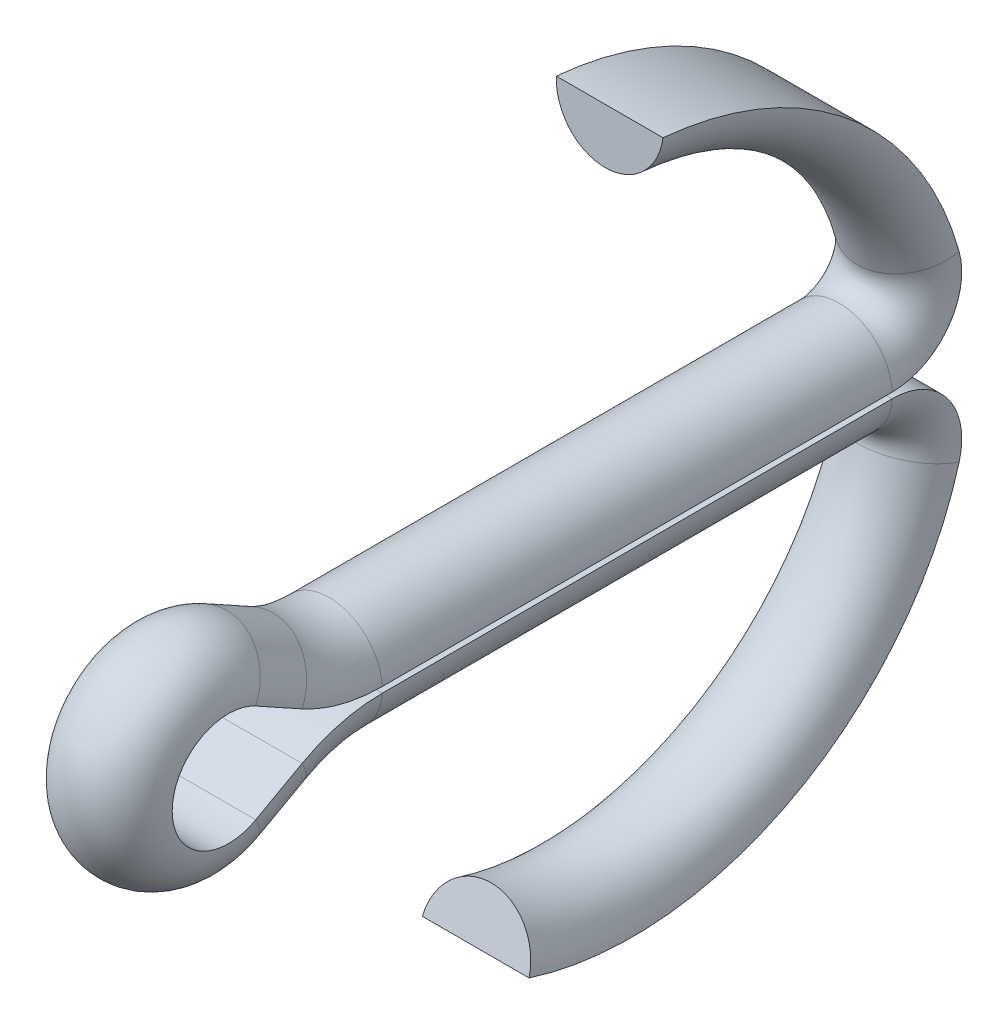
ISO-10303-21;
HEADER;
FILE_DESCRIPTION(('STEP AP214'),'2;1');
FILE_NAME('part.step','',(''),(''),'','','');
FILE_SCHEMA(('AUTOMOTIVE_DESIGN { 1 0 10303 214 1 1 1 1 }'));
ENDSEC;
DATA;
#1=APPLICATION_CONTEXT('core data for automotive mechanical design processes');
#2=APPLICATION_PROTOCOL_DEFINITION('international standard','automotive_design',2000,#1);
#3=PRODUCT_CONTEXT('',#1,'mechanical');
#4=PRODUCT('Part','Part','',(#3));
#5=PRODUCT_RELATED_PRODUCT_CATEGORY('part','',(#4));
#6=PRODUCT_DEFINITION_FORMATION('','',#4);
#7=PRODUCT_DEFINITION_CONTEXT('part definition',#1,'design');
#8=PRODUCT_DEFINITION('design','',#6,#7);
#9=PRODUCT_DEFINITION_SHAPE('','',#8);
#10=(LENGTH_UNIT() NAMED_UNIT(*) SI_UNIT(.MILLI.,.METRE.));
#11=(NAMED_UNIT(*) PLANE_ANGLE_UNIT() SI_UNIT($,.RADIAN.));
#12=(NAMED_UNIT(*) SI_UNIT($,.STERADIAN.) SOLID_ANGLE_UNIT());
#13=UNCERTAINTY_MEASURE_WITH_UNIT(LENGTH_MEASURE(1.E-05),#10,'distance_accuracy_value','');
#14=(GEOMETRIC_REPRESENTATION_CONTEXT(3) GLOBAL_UNCERTAINTY_ASSIGNED_CONTEXT((#13)) GLOBAL_UNIT_ASSIGNED_CONTEXT((#10,
#11,#12)) REPRESENTATION_CONTEXT('',''));
#15=CARTESIAN_POINT('',(0.,0.,0.));
#16=DIRECTION('',(0.,0.,1.));
#17=DIRECTION('',(1.,0.,0.));
#18=AXIS2_PLACEMENT_3D('',#15,#16,#17);
#19=CARTESIAN_POINT('',(0.,-0.364206321544341,-20.5157499936539));
#20=DIRECTION('',(0.,0.,1.));
#21=DIRECTION('',(0.,-1.,0.));
#22=AXIS2_PLACEMENT_3D('',#19,#20,#21);
#23=CYLINDRICAL_SURFACE('',#22,0.555857142857143);
#24=DIRECTION('',(0.,0.,1.));
#25=VECTOR('',#24,1.);
#26=CARTESIAN_POINT('',(0.555000000000001,-0.333349178687198,-20.5157499936539));
#27=LINE('',#26,#25);
#28=CARTESIAN_POINT('',(0.555000000000001,-0.333349178687199,-16.5257499936539));
#29=VERTEX_POINT('',#28);
#30=CARTESIAN_POINT('',(0.555000000000001,-0.333349178687199,-11.2254818440781));
#31=VERTEX_POINT('',#30);
#32=EDGE_CURVE('E242',#29,#31,#27,.T.);
#33=ORIENTED_EDGE('',*,*,#32,.F.);
#34=CARTESIAN_POINT('',(0.,-0.364206321544341,-16.5257499936539));
#35=DIRECTION('',(0.,0.,-1.));
#36=DIRECTION('',(-1.,0.,0.));
#37=AXIS2_PLACEMENT_3D('',#34,#35,#36);
#38=CIRCLE('',#37,0.555857142857143);
#39=CARTESIAN_POINT('',(-0.555,-0.333349178687199,-16.5257499936539));
#40=VERTEX_POINT('',#39);
#41=EDGE_CURVE('E246',#29,#40,#38,.F.);
#42=ORIENTED_EDGE('',*,*,#41,.T.);
#43=DIRECTION('',(0.,0.,1.));
#44=VECTOR('',#43,1.);
#45=CARTESIAN_POINT('',(-0.555,-0.333349178687198,-20.5157499936539));
#46=LINE('',#45,#44);
#47=CARTESIAN_POINT('',(-0.555,-0.333349178687199,-11.2254818440781));
#48=VERTEX_POINT('',#47);
#49=EDGE_CURVE('E171',#40,#48,#46,.T.);
#50=ORIENTED_EDGE('',*,*,#49,.T.);
#51=CARTESIAN_POINT('',(0.,-0.364206321544342,-11.2254818440781));
#52=DIRECTION('',(0.,0.,1.));
#53=DIRECTION('',(-1.,0.,0.));
#54=AXIS2_PLACEMENT_3D('',#51,#52,#53);
#55=CIRCLE('',#54,0.555857142857143);
#56=EDGE_CURVE('E245',#31,#48,#55,.T.);
#57=ORIENTED_EDGE('',*,*,#56,.F.);
#58=EDGE_LOOP('',(#33,#42,#50,#57));
#59=FACE_BOUND('',#58,.T.);
#60=ADVANCED_FACE('F43',(#59),#23,.T.);
#61=CARTESIAN_POINT('',(-0.555,-0.333349178687198,-20.5157499936539));
#62=DIRECTION('',(0.,-1.,0.));
#63=DIRECTION('',(0.,0.,-1.));
#64=AXIS2_PLACEMENT_3D('',#61,#62,#63);
#65=PLANE('',#64);
#66=ORIENTED_EDGE('',*,*,#49,.F.);
#67=DIRECTION('',(1.,0.,0.));
#68=VECTOR('',#67,1.);
#69=CARTESIAN_POINT('',(-0.555,-0.333349178687199,-16.5257499936539));
#70=LINE('',#69,#68);
#71=EDGE_CURVE('E143',#40,#29,#70,.T.);
#72=ORIENTED_EDGE('',*,*,#71,.T.);
#73=ORIENTED_EDGE('',*,*,#32,.T.);
#74=DIRECTION('',(1.,0.,0.));
#75=VECTOR('',#74,1.);
#76=CARTESIAN_POINT('',(-0.555,-0.333349178687199,-11.2254818440781));
#77=LINE('',#76,#75);
#78=EDGE_CURVE('E166',#48,#31,#77,.T.);
#79=ORIENTED_EDGE('',*,*,#78,.F.);
#80=EDGE_LOOP('',(#66,#72,#73,#79));
#81=FACE_BOUND('',#80,.T.);
#82=ADVANCED_FACE('F330',(#81),#65,.T.);
#83=CARTESIAN_POINT('',(0.,-0.362492035830054,-11.2254818440781));
#84=DIRECTION('',(0.,0.,-1.));
#85=DIRECTION('',(0.,1.,0.));
#86=AXIS2_PLACEMENT_3D('',#83,#84,#85);
#87=CYLINDRICAL_SURFACE('',#86,0.555857142857143);
#88=DIRECTION('',(0.,0.,-1.));
#89=VECTOR('',#88,1.);
#90=CARTESIAN_POINT('',(-0.555,-0.393349178687197,-11.2254818440781));
#91=LINE('',#90,#89);
#92=CARTESIAN_POINT('',(-0.555,-0.393349178687196,-11.2254818440781));
#93=VERTEX_POINT('',#92);
#94=CARTESIAN_POINT('',(-0.555,-0.393349178687197,-16.5257499936539));
#95=VERTEX_POINT('',#94);
#96=EDGE_CURVE('E52',#93,#95,#91,.T.);
#97=ORIENTED_EDGE('',*,*,#96,.T.);
#98=CARTESIAN_POINT('',(0.,-0.362492035830055,-16.5257499936539));
#99=DIRECTION('',(0.,0.,-1.));
#100=DIRECTION('',(-1.,0.,0.));
#101=AXIS2_PLACEMENT_3D('',#98,#99,#100);
#102=CIRCLE('',#101,0.555857142857143);
#103=CARTESIAN_POINT('',(0.555000000000001,-0.393349178687197,-16.5257499936539));
#104=VERTEX_POINT('',#103);
#105=EDGE_CURVE('E133',#95,#104,#102,.F.);
#106=ORIENTED_EDGE('',*,*,#105,.T.);
#107=DIRECTION('',(0.,0.,-1.));
#108=VECTOR('',#107,1.);
#109=CARTESIAN_POINT('',(0.555000000000001,-0.393349178687197,-11.2254818440781));
#110=LINE('',#109,#108);
#111=CARTESIAN_POINT('',(0.555000000000001,-0.393349178687196,-11.2254818440781));
#112=VERTEX_POINT('',#111);
#113=EDGE_CURVE('E65',#112,#104,#110,.T.);
#114=ORIENTED_EDGE('',*,*,#113,.F.);
#115=CARTESIAN_POINT('',(0.,-0.362492035830054,-11.2254818440781));
#116=DIRECTION('',(0.,0.,-1.));
#117=DIRECTION('',(-1.,0.,0.));
#118=AXIS2_PLACEMENT_3D('',#115,#116,#117);
#119=CIRCLE('',#118,0.555857142857143);
#120=EDGE_CURVE('E156',#112,#93,#119,.T.);
#121=ORIENTED_EDGE('',*,*,#120,.T.);
#122=EDGE_LOOP('',(#97,#106,#114,#121));
#123=FACE_BOUND('',#122,.T.);
#124=ADVANCED_FACE('F154',(#123),#87,.T.);
#125=CARTESIAN_POINT('',(-0.555,-0.393349178687197,-11.2254818440781));
#126=DIRECTION('',(0.,1.,0.));
#127=DIRECTION('',(0.,0.,1.));
#128=AXIS2_PLACEMENT_3D('',#125,#126,#127);
#129=PLANE('',#128);
#130=ORIENTED_EDGE('',*,*,#113,.T.);
#131=DIRECTION('',(-1.,0.,0.));
#132=VECTOR('',#131,1.);
#133=CARTESIAN_POINT('',(-0.555,-0.393349178687197,-16.5257499936539));
#134=LINE('',#133,#132);
#135=EDGE_CURVE('E11',#104,#95,#134,.T.);
#136=ORIENTED_EDGE('',*,*,#135,.T.);
#137=ORIENTED_EDGE('',*,*,#96,.F.);
#138=DIRECTION('',(1.,0.,0.));
#139=VECTOR('',#138,1.);
#140=CARTESIAN_POINT('',(-0.555,-0.393349178687197,-11.2254818440781));
#141=LINE('',#140,#139);
#142=EDGE_CURVE('E160',#93,#112,#141,.T.);
#143=ORIENTED_EDGE('',*,*,#142,.T.);
#144=EDGE_LOOP('',(#130,#136,#137,#143));
#145=FACE_BOUND('',#144,.T.);
#146=ADVANCED_FACE('F45',(#145),#129,.T.);
#147=CARTESIAN_POINT('',(0.,1.3916508213128,-11.2254818440781));
#148=DIRECTION('',(-1.,0.,0.));
#149=DIRECTION('',(0.,0.,1.));
#150=AXIS2_PLACEMENT_3D('',#147,#148,#149);
#151=TOROIDAL_SURFACE('',#150,1.75585714285718,0.555857142857143);
#152=CARTESIAN_POINT('',(-0.555,1.3916508213128,-11.2254818440781));
#153=DIRECTION('',(-1.,0.,0.));
#154=DIRECTION('',(0.,-1.,0.));
#155=AXIS2_PLACEMENT_3D('',#152,#153,#154);
#156=CIRCLE('',#155,1.72500000000004);
#157=CARTESIAN_POINT('',(-0.555,-0.117863542524628,-10.3906217447988));
#158=VERTEX_POINT('',#157);
#159=EDGE_CURVE('E177',#48,#158,#156,.T.);
#160=ORIENTED_EDGE('',*,*,#159,.T.);
#161=CARTESIAN_POINT('',(0.,-0.144866035492616,-10.375687601408));
#162=DIRECTION('',(0.,0.4839768691474,0.875080790630374));
#163=DIRECTION('',(-1.,0.,0.));
#164=AXIS2_PLACEMENT_3D('',#161,#162,#163);
#165=CIRCLE('',#164,0.555857142857143);
#166=CARTESIAN_POINT('',(0.555000000000001,-0.117863542524628,-10.3906217447988));
#167=VERTEX_POINT('',#166);
#168=EDGE_CURVE('E235',#167,#158,#165,.T.);
#169=ORIENTED_EDGE('',*,*,#168,.F.);
#170=CARTESIAN_POINT('',(0.555000000000001,1.3916508213128,-11.2254818440781));
#171=DIRECTION('',(-1.,0.,0.));
#172=DIRECTION('',(0.,-1.,0.));
#173=AXIS2_PLACEMENT_3D('',#170,#171,#172);
#174=CIRCLE('',#173,1.72500000000004);
#175=EDGE_CURVE('E170',#31,#167,#174,.T.);
#176=ORIENTED_EDGE('',*,*,#175,.F.);
#177=ORIENTED_EDGE('',*,*,#56,.T.);
#178=EDGE_LOOP('',(#160,#169,#176,#177));
#179=FACE_BOUND('',#178,.T.);
#180=ADVANCED_FACE('F326',(#179),#151,.T.);
#181=CARTESIAN_POINT('',(0.,1.3916508213128,-11.2254818440781));
#182=DIRECTION('',(-1.,0.,0.));
#183=DIRECTION('',(0.,0.,1.));
#184=AXIS2_PLACEMENT_3D('',#181,#182,#183);
#185=CYLINDRICAL_SURFACE('',#184,1.72500000000004);
#186=DIRECTION('',(1.,0.,0.));
#187=VECTOR('',#186,1.);
#188=CARTESIAN_POINT('',(-0.555,-0.117863542524593,-10.3906217447988));
#189=LINE('',#188,#187);
#190=EDGE_CURVE('E172',#158,#167,#189,.T.);
#191=ORIENTED_EDGE('',*,*,#190,.F.);
#192=ORIENTED_EDGE('',*,*,#159,.F.);
#193=ORIENTED_EDGE('',*,*,#78,.T.);
#194=ORIENTED_EDGE('',*,*,#175,.T.);
#195=EDGE_LOOP('',(#191,#192,#193,#194));
#196=FACE_BOUND('',#195,.T.);
#197=ADVANCED_FACE('F344',(#196),#185,.T.);
#198=CARTESIAN_POINT('',(0.,-0.144866035492617,-10.375687601408));
#199=DIRECTION('',(0.,0.483976869147397,0.875080790630375));
#200=DIRECTION('',(0.,-0.875080790630376,0.483976869147397));
#201=AXIS2_PLACEMENT_3D('',#198,#199,#200);
#202=CYLINDRICAL_SURFACE('',#201,0.555857142857143);
#203=DIRECTION('',(0.,0.483976869147397,0.875080790630375));
#204=VECTOR('',#203,1.);
#205=CARTESIAN_POINT('',(-0.555,-0.117863542524594,-10.3906217447988));
#206=LINE('',#205,#204);
#207=CARTESIAN_POINT('',(-0.555,0.148573083831572,-9.90887646210508));
#208=VERTEX_POINT('',#207);
#209=EDGE_CURVE('E183',#158,#208,#206,.T.);
#210=ORIENTED_EDGE('',*,*,#209,.T.);
#211=CARTESIAN_POINT('',(0.,0.121570590863549,-9.89394231871425));
#212=DIRECTION('',(0.,0.483976869147397,0.875080790630375));
#213=DIRECTION('',(-1.,0.,0.));
#214=AXIS2_PLACEMENT_3D('',#211,#212,#213);
#215=CIRCLE('',#214,0.555857142857143);
#216=CARTESIAN_POINT('',(0.555000000000001,0.148573083831572,-9.90887646210508));
#217=VERTEX_POINT('',#216);
#218=EDGE_CURVE('E225',#217,#208,#215,.T.);
#219=ORIENTED_EDGE('',*,*,#218,.F.);
#220=DIRECTION('',(0.,0.483976869147397,0.875080790630375));
#221=VECTOR('',#220,1.);
#222=CARTESIAN_POINT('',(0.555000000000001,-0.117863542524594,-10.3906217447988));
#223=LINE('',#222,#221);
#224=EDGE_CURVE('E176',#167,#217,#223,.T.);
#225=ORIENTED_EDGE('',*,*,#224,.F.);
#226=ORIENTED_EDGE('',*,*,#168,.T.);
#227=EDGE_LOOP('',(#210,#219,#225,#226));
#228=FACE_BOUND('',#227,.T.);
#229=ADVANCED_FACE('F346',(#228),#202,.T.);
#230=CARTESIAN_POINT('',(-0.555,-0.117863542524594,-10.3906217447988));
#231=DIRECTION('',(0.,-0.875080790630375,0.483976869147397));
#232=DIRECTION('',(0.,-0.483976869147397,-0.875080790630375));
#233=AXIS2_PLACEMENT_3D('',#230,#231,#232);
#234=PLANE('',#233);
#235=DIRECTION('',(1.,0.,0.));
#236=VECTOR('',#235,1.);
#237=CARTESIAN_POINT('',(-0.555,0.148573083831571,-9.90887646210508));
#238=LINE('',#237,#236);
#239=EDGE_CURVE('E178',#208,#217,#238,.T.);
#240=ORIENTED_EDGE('',*,*,#239,.F.);
#241=ORIENTED_EDGE('',*,*,#209,.F.);
#242=ORIENTED_EDGE('',*,*,#190,.T.);
#243=ORIENTED_EDGE('',*,*,#224,.T.);
#244=EDGE_LOOP('',(#240,#241,#242,#243));
#245=FACE_BOUND('',#244,.T.);
#246=ADVANCED_FACE('F349',(#245),#234,.T.);
#247=CARTESIAN_POINT('',(0.,-0.363349178687198,-9.62574999365386));
#248=DIRECTION('',(1.,0.,0.));
#249=DIRECTION('',(0.,0.,-1.));
#250=AXIS2_PLACEMENT_3D('',#247,#248,#249);
#251=DEGENERATE_TOROIDAL_SURFACE('',#250,0.554142857142856,0.555857142857143,.T.);
#252=CARTESIAN_POINT('',(-0.555,-0.363349178687198,-9.62574999365386));
#253=DIRECTION('',(1.,0.,0.));
#254=DIRECTION('',(0.,0.875080790630376,-0.483976869147396));
#255=AXIS2_PLACEMENT_3D('',#252,#253,#254);
#256=CIRCLE('',#255,0.584999999999999);
#257=CARTESIAN_POINT('',(-0.555,-0.875271441205968,-9.90887646210508));
#258=VERTEX_POINT('',#257);
#259=EDGE_CURVE('E189',#208,#258,#256,.T.);
#260=ORIENTED_EDGE('',*,*,#259,.T.);
#261=CARTESIAN_POINT('',(0.,-0.848268948237945,-9.89394231871425));
#262=DIRECTION('',(0.,0.483976869147396,-0.875080790630376));
#263=DIRECTION('',(-1.,0.,0.));
#264=AXIS2_PLACEMENT_3D('',#261,#262,#263);
#265=CIRCLE('',#264,0.555857142857143);
#266=CARTESIAN_POINT('',(0.555000000000001,-0.875271441205968,-9.90887646210508));
#267=VERTEX_POINT('',#266);
#268=EDGE_CURVE('E215',#267,#258,#265,.T.);
#269=ORIENTED_EDGE('',*,*,#268,.F.);
#270=CARTESIAN_POINT('',(0.555000000000001,-0.363349178687198,-9.62574999365386));
#271=DIRECTION('',(1.,0.,0.));
#272=DIRECTION('',(0.,0.875080790630376,-0.483976869147396));
#273=AXIS2_PLACEMENT_3D('',#270,#271,#272);
#274=CIRCLE('',#273,0.584999999999999);
#275=EDGE_CURVE('E182',#217,#267,#274,.T.);
#276=ORIENTED_EDGE('',*,*,#275,.F.);
#277=ORIENTED_EDGE('',*,*,#218,.T.);
#278=EDGE_LOOP('',(#260,#269,#276,#277));
#279=FACE_BOUND('',#278,.T.);
#280=ADVANCED_FACE('F351',(#279),#251,.T.);
#281=CARTESIAN_POINT('',(0.,-0.363349178687198,-9.62574999365386));
#282=DIRECTION('',(1.,0.,0.));
#283=DIRECTION('',(0.,0.,-1.));
#284=AXIS2_PLACEMENT_3D('',#281,#282,#283);
#285=CYLINDRICAL_SURFACE('',#284,0.584999999999999);
#286=DIRECTION('',(1.,0.,0.));
#287=VECTOR('',#286,1.);
#288=CARTESIAN_POINT('',(-0.555,-0.875271441205967,-9.90887646210508));
#289=LINE('',#288,#287);
#290=EDGE_CURVE('E184',#258,#267,#289,.T.);
#291=ORIENTED_EDGE('',*,*,#290,.F.);
#292=ORIENTED_EDGE('',*,*,#259,.F.);
#293=ORIENTED_EDGE('',*,*,#239,.T.);
#294=ORIENTED_EDGE('',*,*,#275,.T.);
#295=EDGE_LOOP('',(#291,#292,#293,#294));
#296=FACE_BOUND('',#295,.T.);
#297=ADVANCED_FACE('F354',(#296),#285,.F.);
#298=CARTESIAN_POINT('',(0.,-0.848268948237946,-9.89394231871425));
#299=DIRECTION('',(0.,0.483976869147397,-0.875080790630375));
#300=DIRECTION('',(0.,0.875080790630376,0.483976869147397));
#301=AXIS2_PLACEMENT_3D('',#298,#299,#300);
#302=CYLINDRICAL_SURFACE('',#301,0.555857142857143);
#303=DIRECTION('',(0.,0.483976869147397,-0.875080790630375));
#304=VECTOR('',#303,1.);
#305=CARTESIAN_POINT('',(-0.555,-0.875271441205968,-9.90887646210508));
#306=LINE('',#305,#304);
#307=CARTESIAN_POINT('',(-0.555,-0.608834814849802,-10.3906217447988));
#308=VERTEX_POINT('',#307);
#309=EDGE_CURVE('E193',#258,#308,#306,.T.);
#310=ORIENTED_EDGE('',*,*,#309,.T.);
#311=CARTESIAN_POINT('',(0.,-0.581832321881779,-10.375687601408));
#312=DIRECTION('',(0.,0.483976869147397,-0.875080790630375));
#313=DIRECTION('',(-1.,0.,0.));
#314=AXIS2_PLACEMENT_3D('',#311,#312,#313);
#315=CIRCLE('',#314,0.555857142857143);
#316=CARTESIAN_POINT('',(0.555000000000001,-0.608834814849802,-10.3906217447988));
#317=VERTEX_POINT('',#316);
#318=EDGE_CURVE('E206',#317,#308,#315,.T.);
#319=ORIENTED_EDGE('',*,*,#318,.F.);
#320=DIRECTION('',(0.,0.483976869147397,-0.875080790630375));
#321=VECTOR('',#320,1.);
#322=CARTESIAN_POINT('',(0.555000000000001,-0.875271441205968,-9.90887646210508));
#323=LINE('',#322,#321);
#324=EDGE_CURVE('E188',#267,#317,#323,.T.);
#325=ORIENTED_EDGE('',*,*,#324,.F.);
#326=ORIENTED_EDGE('',*,*,#268,.T.);
#327=EDGE_LOOP('',(#310,#319,#325,#326));
#328=FACE_BOUND('',#327,.T.);
#329=ADVANCED_FACE('F356',(#328),#302,.T.);
#330=CARTESIAN_POINT('',(-0.555,-0.875271441205968,-9.90887646210508));
#331=DIRECTION('',(0.,0.875080790630375,0.483976869147397));
#332=DIRECTION('',(0.,-0.483976869147397,0.875080790630375));
#333=AXIS2_PLACEMENT_3D('',#330,#331,#332);
#334=PLANE('',#333);
#335=DIRECTION('',(1.,0.,0.));
#336=VECTOR('',#335,1.);
#337=CARTESIAN_POINT('',(-0.555,-0.608834814849802,-10.3906217447988));
#338=LINE('',#337,#336);
#339=EDGE_CURVE('E190',#308,#317,#338,.T.);
#340=ORIENTED_EDGE('',*,*,#339,.F.);
#341=ORIENTED_EDGE('',*,*,#309,.F.);
#342=ORIENTED_EDGE('',*,*,#290,.T.);
#343=ORIENTED_EDGE('',*,*,#324,.T.);
#344=EDGE_LOOP('',(#340,#341,#342,#343));
#345=FACE_BOUND('',#344,.T.);
#346=ADVANCED_FACE('F359',(#345),#334,.T.);
#347=CARTESIAN_POINT('',(0.,-2.1183491786872,-11.2254818440781));
#348=DIRECTION('',(-1.,0.,0.));
#349=DIRECTION('',(0.,0.,1.));
#350=AXIS2_PLACEMENT_3D('',#347,#348,#349);
#351=TOROIDAL_SURFACE('',#350,1.75585714285714,0.555857142857143);
#352=CARTESIAN_POINT('',(-0.555,-2.1183491786872,-11.2254818440781));
#353=DIRECTION('',(-1.,0.,0.));
#354=DIRECTION('',(0.,0.875080790630374,0.4839768691474));
#355=AXIS2_PLACEMENT_3D('',#352,#353,#354);
#356=CIRCLE('',#355,1.725);
#357=EDGE_CURVE('E195',#308,#93,#356,.T.);
#358=ORIENTED_EDGE('',*,*,#357,.T.);
#359=ORIENTED_EDGE('',*,*,#120,.F.);
#360=CARTESIAN_POINT('',(0.555000000000001,-2.1183491786872,-11.2254818440781));
#361=DIRECTION('',(-1.,0.,0.));
#362=DIRECTION('',(0.,0.875080790630374,0.4839768691474));
#363=AXIS2_PLACEMENT_3D('',#360,#361,#362);
#364=CIRCLE('',#363,1.725);
#365=EDGE_CURVE('E163',#317,#112,#364,.T.);
#366=ORIENTED_EDGE('',*,*,#365,.F.);
#367=ORIENTED_EDGE('',*,*,#318,.T.);
#368=EDGE_LOOP('',(#358,#359,#366,#367));
#369=FACE_BOUND('',#368,.T.);
#370=ADVANCED_FACE('F361',(#369),#351,.T.);
#371=CARTESIAN_POINT('',(0.,-2.1183491786872,-11.2254818440781));
#372=DIRECTION('',(-1.,0.,0.));
#373=DIRECTION('',(0.,0.,1.));
#374=AXIS2_PLACEMENT_3D('',#371,#372,#373);
#375=CYLINDRICAL_SURFACE('',#374,1.725);
#376=ORIENTED_EDGE('',*,*,#142,.F.);
#377=ORIENTED_EDGE('',*,*,#357,.F.);
#378=ORIENTED_EDGE('',*,*,#339,.T.);
#379=ORIENTED_EDGE('',*,*,#365,.T.);
#380=EDGE_LOOP('',(#376,#377,#378,#379));
#381=FACE_BOUND('',#380,.T.);
#382=ADVANCED_FACE('F364',(#381),#375,.T.);
#383=CARTESIAN_POINT('',(0.,3.17805183124376,-14.1460606354816));
#384=DIRECTION('',(0.,0.0900797273229016,0.995934557451157));
#385=DIRECTION('',(-1.,0.,0.));
#386=AXIS2_PLACEMENT_3D('',#383,#384,#385);
#387=PLANE('',#386);
#388=CARTESIAN_POINT('',(0.,3.17805183124376,-14.1460606354816));
#389=DIRECTION('',(0.,0.0900797273229016,0.995934557451157));
#390=DIRECTION('',(-1.,0.,0.));
#391=AXIS2_PLACEMENT_3D('',#388,#389,#390);
#392=CIRCLE('',#391,0.555857142857143);
#393=CARTESIAN_POINT('',(-0.555,3.14732013632813,-14.1432810324671));
#394=VERTEX_POINT('',#393);
#395=CARTESIAN_POINT('',(0.555000000000001,3.14732013632813,-14.1432810324671));
#396=VERTEX_POINT('',#395);
#397=EDGE_CURVE('E269',#394,#396,#392,.T.);
#398=ORIENTED_EDGE('',*,*,#397,.T.);
#399=DIRECTION('',(-1.,0.,0.));
#400=VECTOR('',#399,1.);
#401=CARTESIAN_POINT('',(0.555000000000001,3.14732013632813,-14.1432810324671));
#402=LINE('',#401,#400);
#403=EDGE_CURVE('E264',#396,#394,#402,.T.);
#404=ORIENTED_EDGE('',*,*,#403,.T.);
#405=EDGE_LOOP('',(#398,#404));
#406=FACE_BOUND('',#405,.T.);
#407=ADVANCED_FACE('F341',(#406),#387,.T.);
#408=CARTESIAN_POINT('',(0.,-0.363349178687198,-13.8257499936539));
#409=DIRECTION('',(-1.,0.,0.));
#410=DIRECTION('',(0.,0.,1.));
#411=AXIS2_PLACEMENT_3D('',#408,#409,#410);
#412=TOROIDAL_SURFACE('',#411,3.55585714285714,0.555857142857143);
#413=CARTESIAN_POINT('',(0.555000000000001,-0.363349178687198,-13.8257499936539));
#414=DIRECTION('',(-1.,0.,0.));
#415=DIRECTION('',(0.,0.995934557451157,-0.0900797273229021));
#416=AXIS2_PLACEMENT_3D('',#413,#414,#415);
#417=CIRCLE('',#416,3.525);
#418=CARTESIAN_POINT('',(0.555000000000001,0.58264462275574,-17.2214414884206));
#419=VERTEX_POINT('',#418);
#420=EDGE_CURVE('E263',#396,#419,#417,.T.);
#421=ORIENTED_EDGE('',*,*,#420,.F.);
#422=ORIENTED_EDGE('',*,*,#397,.F.);
#423=CARTESIAN_POINT('',(-0.555,-0.363349178687198,-13.8257499936539));
#424=DIRECTION('',(-1.,0.,0.));
#425=DIRECTION('',(0.,0.995934557451157,-0.0900797273229021));
#426=AXIS2_PLACEMENT_3D('',#423,#424,#425);
#427=CIRCLE('',#426,3.525);
#428=CARTESIAN_POINT('',(-0.555,0.58264462275574,-17.2214414884206));
#429=VERTEX_POINT('',#428);
#430=EDGE_CURVE('E268',#394,#429,#427,.T.);
#431=ORIENTED_EDGE('',*,*,#430,.T.);
#432=CARTESIAN_POINT('',(0.,0.590925662719739,-17.2511666905633));
#433=DIRECTION('',(0.,0.963316736104055,0.268367035870337));
#434=DIRECTION('',(-1.,0.,0.));
#435=AXIS2_PLACEMENT_3D('',#432,#433,#434);
#436=CIRCLE('',#435,0.555857142857143);
#437=EDGE_CURVE('E278',#429,#419,#436,.T.);
#438=ORIENTED_EDGE('',*,*,#437,.T.);
#439=EDGE_LOOP('',(#421,#422,#431,#438));
#440=FACE_BOUND('',#439,.T.);
#441=ADVANCED_FACE('F383',(#440),#412,.T.);
#442=CARTESIAN_POINT('',(0.,-0.363349178687198,-13.8257499936539));
#443=DIRECTION('',(-1.,0.,0.));
#444=DIRECTION('',(0.,0.,1.));
#445=AXIS2_PLACEMENT_3D('',#442,#443,#444);
#446=CYLINDRICAL_SURFACE('',#445,3.525);
#447=DIRECTION('',(-1.,0.,0.));
#448=VECTOR('',#447,1.);
#449=CARTESIAN_POINT('',(0.555000000000001,0.58264462275574,-17.2214414884206));
#450=LINE('',#449,#448);
#451=EDGE_CURVE('E258',#419,#429,#450,.T.);
#452=ORIENTED_EDGE('',*,*,#451,.T.);
#453=ORIENTED_EDGE('',*,*,#430,.F.);
#454=ORIENTED_EDGE('',*,*,#403,.F.);
#455=ORIENTED_EDGE('',*,*,#420,.T.);
#456=EDGE_LOOP('',(#452,#453,#454,#455));
#457=FACE_BOUND('',#456,.T.);
#458=ADVANCED_FACE('F446',(#457),#446,.T.);
#459=CARTESIAN_POINT('',(0.,0.388834365616597,-16.5257499936539));
#460=DIRECTION('',(-1.,0.,0.));
#461=DIRECTION('',(0.,0.,1.));
#462=AXIS2_PLACEMENT_3D('',#459,#460,#461);
#463=TOROIDAL_SURFACE('',#462,0.753040687160938,0.555857142857143);
#464=CARTESIAN_POINT('',(0.555000000000001,0.388834365616597,-16.5257499936539));
#465=DIRECTION('',(-1.,0.,0.));
#466=DIRECTION('',(0.,0.268367035870333,-0.963316736104056));
#467=AXIS2_PLACEMENT_3D('',#464,#465,#466);
#468=CIRCLE('',#467,0.722183544303796);
#469=EDGE_CURVE('E144',#419,#29,#468,.T.);
#470=ORIENTED_EDGE('',*,*,#469,.F.);
#471=ORIENTED_EDGE('',*,*,#437,.F.);
#472=CARTESIAN_POINT('',(-0.555,0.388834365616597,-16.5257499936539));
#473=DIRECTION('',(-1.,0.,0.));
#474=DIRECTION('',(0.,0.268367035870333,-0.963316736104056));
#475=AXIS2_PLACEMENT_3D('',#472,#473,#474);
#476=CIRCLE('',#475,0.722183544303796);
#477=EDGE_CURVE('E262',#429,#40,#476,.T.);
#478=ORIENTED_EDGE('',*,*,#477,.T.);
#479=ORIENTED_EDGE('',*,*,#41,.F.);
#480=EDGE_LOOP('',(#470,#471,#478,#479));
#481=FACE_BOUND('',#480,.T.);
#482=ADVANCED_FACE('F323',(#481),#463,.T.);
#483=CARTESIAN_POINT('',(0.,0.388834365616597,-16.5257499936539));
#484=DIRECTION('',(-1.,0.,0.));
#485=DIRECTION('',(0.,0.,1.));
#486=AXIS2_PLACEMENT_3D('',#483,#484,#485);
#487=CYLINDRICAL_SURFACE('',#486,0.722183544303796);
#488=ORIENTED_EDGE('',*,*,#71,.F.);
#489=ORIENTED_EDGE('',*,*,#477,.F.);
#490=ORIENTED_EDGE('',*,*,#451,.F.);
#491=ORIENTED_EDGE('',*,*,#469,.T.);
#492=EDGE_LOOP('',(#488,#489,#490,#491));
#493=FACE_BOUND('',#492,.T.);
#494=ADVANCED_FACE('F316',(#493),#487,.T.);
#495=CARTESIAN_POINT('',(0.,-3.74993035222142,-12.7416891210679));
#496=DIRECTION('',(0.,0.304866261222988,0.952395171537486));
#497=DIRECTION('',(-1.,0.,0.));
#498=AXIS2_PLACEMENT_3D('',#495,#496,#497);
#499=PLANE('',#498);
#500=CARTESIAN_POINT('',(0.,-3.74993035222142,-12.7416891210679));
#501=DIRECTION('',(0.,0.304866261222988,0.952395171537486));
#502=DIRECTION('',(-1.,0.,0.));
#503=AXIS2_PLACEMENT_3D('',#500,#501,#502);
#504=CIRCLE('',#503,0.555857142857143);
#505=CARTESIAN_POINT('',(0.555000000000001,-3.72054215835683,-12.7510964228428));
#506=VERTEX_POINT('',#505);
#507=CARTESIAN_POINT('',(-0.555,-3.72054215835683,-12.7510964228428));
#508=VERTEX_POINT('',#507);
#509=EDGE_CURVE('E298',#506,#508,#504,.T.);
#510=ORIENTED_EDGE('',*,*,#509,.T.);
#511=DIRECTION('',(1.,0.,0.));
#512=VECTOR('',#511,1.);
#513=CARTESIAN_POINT('',(-0.555,-3.72054215835683,-12.7510964228428));
#514=LINE('',#513,#512);
#515=EDGE_CURVE('E288',#508,#506,#514,.T.);
#516=ORIENTED_EDGE('',*,*,#515,.T.);
#517=EDGE_LOOP('',(#510,#516));
#518=FACE_BOUND('',#517,.T.);
#519=ADVANCED_FACE('F314',(#518),#499,.T.);
#520=CARTESIAN_POINT('',(0.,-1.11553272299099,-16.5257499936539));
#521=DIRECTION('',(-1.,0.,0.));
#522=DIRECTION('',(0.,0.,1.));
#523=AXIS2_PLACEMENT_3D('',#520,#521,#522);
#524=TOROIDAL_SURFACE('',#523,0.753040687160938,0.555857142857143);
#525=CARTESIAN_POINT('',(-0.555,-1.11553272299099,-16.5257499936539));
#526=DIRECTION('',(-1.,0.,0.));
#527=DIRECTION('',(0.,1.,0.));
#528=AXIS2_PLACEMENT_3D('',#525,#526,#527);
#529=CIRCLE('',#528,0.722183544303795);
#530=CARTESIAN_POINT('',(-0.555,-1.30934298013014,-17.2214414884206));
#531=VERTEX_POINT('',#530);
#532=EDGE_CURVE('E137',#95,#531,#529,.T.);
#533=ORIENTED_EDGE('',*,*,#532,.T.);
#534=CARTESIAN_POINT('',(0.,-1.31762402009414,-17.2511666905633));
#535=DIRECTION('',(0.,-0.963316736104054,0.268367035870341));
#536=DIRECTION('',(-1.,0.,0.));
#537=AXIS2_PLACEMENT_3D('',#534,#535,#536);
#538=CIRCLE('',#537,0.555857142857143);
#539=CARTESIAN_POINT('',(0.555000000000001,-1.30934298013014,-17.2214414884206));
#540=VERTEX_POINT('',#539);
#541=EDGE_CURVE('E152',#540,#531,#538,.T.);
#542=ORIENTED_EDGE('',*,*,#541,.F.);
#543=CARTESIAN_POINT('',(0.555000000000001,-1.11553272299099,-16.5257499936539));
#544=DIRECTION('',(-1.,0.,0.));
#545=DIRECTION('',(0.,1.,0.));
#546=AXIS2_PLACEMENT_3D('',#543,#544,#545);
#547=CIRCLE('',#546,0.722183544303795);
#548=EDGE_CURVE('E140',#104,#540,#547,.T.);
#549=ORIENTED_EDGE('',*,*,#548,.F.);
#550=ORIENTED_EDGE('',*,*,#105,.F.);
#551=EDGE_LOOP('',(#533,#542,#549,#550));
#552=FACE_BOUND('',#551,.T.);
#553=ADVANCED_FACE('F135',(#552),#524,.T.);
#554=CARTESIAN_POINT('',(0.,-1.11553272299099,-16.5257499936539));
#555=DIRECTION('',(-1.,0.,0.));
#556=DIRECTION('',(0.,0.,1.));
#557=AXIS2_PLACEMENT_3D('',#554,#555,#556);
#558=CYLINDRICAL_SURFACE('',#557,0.722183544303795);
#559=DIRECTION('',(1.,0.,0.));
#560=VECTOR('',#559,1.);
#561=CARTESIAN_POINT('',(-0.555,-1.30934298013014,-17.2214414884206));
#562=LINE('',#561,#560);
#563=EDGE_CURVE('E150',#531,#540,#562,.T.);
#564=ORIENTED_EDGE('',*,*,#563,.F.);
#565=ORIENTED_EDGE('',*,*,#532,.F.);
#566=ORIENTED_EDGE('',*,*,#135,.F.);
#567=ORIENTED_EDGE('',*,*,#548,.T.);
#568=EDGE_LOOP('',(#564,#565,#566,#567));
#569=FACE_BOUND('',#568,.T.);
#570=ADVANCED_FACE('F148',(#569),#558,.T.);
#571=CARTESIAN_POINT('',(0.,-0.363349178687198,-13.8257499936539));
#572=DIRECTION('',(-1.,0.,0.));
#573=DIRECTION('',(0.,0.,1.));
#574=AXIS2_PLACEMENT_3D('',#571,#572,#573);
#575=TOROIDAL_SURFACE('',#574,3.55585714285714,0.555857142857143);
#576=CARTESIAN_POINT('',(-0.555,-0.363349178687198,-13.8257499936539));
#577=DIRECTION('',(-1.,0.,0.));
#578=DIRECTION('',(0.,-0.268367035870337,-0.963316736104055));
#579=AXIS2_PLACEMENT_3D('',#576,#577,#578);
#580=CIRCLE('',#579,3.525);
#581=EDGE_CURVE('E291',#531,#508,#580,.T.);
#582=ORIENTED_EDGE('',*,*,#581,.T.);
#583=ORIENTED_EDGE('',*,*,#509,.F.);
#584=CARTESIAN_POINT('',(0.555000000000001,-0.363349178687198,-13.8257499936539));
#585=DIRECTION('',(-1.,0.,0.));
#586=DIRECTION('',(0.,-0.268367035870337,-0.963316736104055));
#587=AXIS2_PLACEMENT_3D('',#584,#585,#586);
#588=CIRCLE('',#587,3.525);
#589=EDGE_CURVE('E294',#540,#506,#588,.T.);
#590=ORIENTED_EDGE('',*,*,#589,.F.);
#591=ORIENTED_EDGE('',*,*,#541,.T.);
#592=EDGE_LOOP('',(#582,#583,#590,#591));
#593=FACE_BOUND('',#592,.T.);
#594=ADVANCED_FACE('F308',(#593),#575,.T.);
#595=CARTESIAN_POINT('',(0.,-0.363349178687198,-13.8257499936539));
#596=DIRECTION('',(-1.,0.,0.));
#597=DIRECTION('',(0.,0.,1.));
#598=AXIS2_PLACEMENT_3D('',#595,#596,#597);
#599=CYLINDRICAL_SURFACE('',#598,3.525);
#600=ORIENTED_EDGE('',*,*,#515,.F.);
#601=ORIENTED_EDGE('',*,*,#581,.F.);
#602=ORIENTED_EDGE('',*,*,#563,.T.);
#603=ORIENTED_EDGE('',*,*,#589,.T.);
#604=EDGE_LOOP('',(#600,#601,#602,#603));
#605=FACE_BOUND('',#604,.T.);
#606=ADVANCED_FACE('F312',(#605),#599,.T.);
#607=CLOSED_SHELL('',(#60,#82,#124,#146,#180,#197,#229,#246,#280,#297,#329,#346,#370,#382,#407,
#441,#458,#482,#494,#519,#553,#570,#594,#606));
#608=MANIFOLD_SOLID_BREP('B2',#607);
#609=ADVANCED_BREP_SHAPE_REPRESENTATION('',(#18,#608),#14);
#610=SHAPE_DEFINITION_REPRESENTATION(#9,#609);
ENDSEC;
END-ISO-10303-21;
